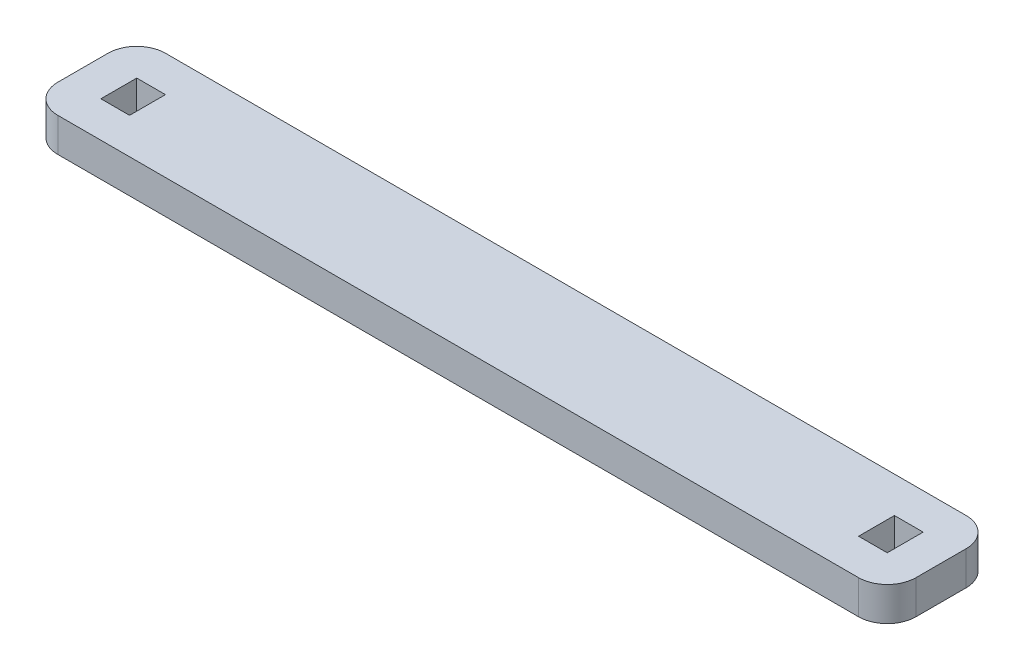
ISO-10303-21;
HEADER;
FILE_DESCRIPTION(('STEP AP214'),'2;1');
FILE_NAME('part.step','',(''),(''),'','','');
FILE_SCHEMA(('AUTOMOTIVE_DESIGN { 1 0 10303 214 1 1 1 1 }'));
ENDSEC;
DATA;
#1=APPLICATION_CONTEXT('core data for automotive mechanical design processes');
#2=APPLICATION_PROTOCOL_DEFINITION('international standard','automotive_design',2000,#1);
#3=PRODUCT_CONTEXT('',#1,'mechanical');
#4=PRODUCT('Part','Part','',(#3));
#5=PRODUCT_RELATED_PRODUCT_CATEGORY('part','',(#4));
#6=PRODUCT_DEFINITION_FORMATION('','',#4);
#7=PRODUCT_DEFINITION_CONTEXT('part definition',#1,'design');
#8=PRODUCT_DEFINITION('design','',#6,#7);
#9=PRODUCT_DEFINITION_SHAPE('','',#8);
#10=(LENGTH_UNIT() NAMED_UNIT(*) SI_UNIT(.MILLI.,.METRE.));
#11=(NAMED_UNIT(*) PLANE_ANGLE_UNIT() SI_UNIT($,.RADIAN.));
#12=(NAMED_UNIT(*) SI_UNIT($,.STERADIAN.) SOLID_ANGLE_UNIT());
#13=UNCERTAINTY_MEASURE_WITH_UNIT(LENGTH_MEASURE(1.E-05),#10,'distance_accuracy_value','');
#14=(GEOMETRIC_REPRESENTATION_CONTEXT(3) GLOBAL_UNCERTAINTY_ASSIGNED_CONTEXT((#13)) GLOBAL_UNIT_ASSIGNED_CONTEXT((#10,
#11,#12)) REPRESENTATION_CONTEXT('',''));
#15=CARTESIAN_POINT('',(0.,0.,0.));
#16=DIRECTION('',(0.,0.,1.));
#17=DIRECTION('',(1.,0.,0.));
#18=AXIS2_PLACEMENT_3D('',#15,#16,#17);
#19=CARTESIAN_POINT('',(0.,1.5,0.));
#20=DIRECTION('',(0.,1.,0.));
#21=DIRECTION('',(0.,0.,1.));
#22=AXIS2_PLACEMENT_3D('',#19,#20,#21);
#23=PLANE('',#22);
#24=DIRECTION('',(-1.,0.,0.));
#25=VECTOR('',#24,1.);
#26=CARTESIAN_POINT('',(37.973,1.5,-4.7625));
#27=LINE('',#26,#25);
#28=CARTESIAN_POINT('',(35.433,1.5,-4.7625));
#29=VERTEX_POINT('',#28);
#30=CARTESIAN_POINT('',(-35.433,1.5,-4.7625));
#31=VERTEX_POINT('',#30);
#32=EDGE_CURVE('E268',#29,#31,#27,.T.);
#33=ORIENTED_EDGE('',*,*,#32,.T.);
#34=CARTESIAN_POINT('',(-35.433,1.5,-2.2225));
#35=DIRECTION('',(0.,1.,0.));
#36=DIRECTION('',(0.,0.,1.));
#37=AXIS2_PLACEMENT_3D('',#34,#35,#36);
#38=CIRCLE('',#37,2.54);
#39=CARTESIAN_POINT('',(-37.973,1.5,-2.2225));
#40=VERTEX_POINT('',#39);
#41=EDGE_CURVE('E319',#31,#40,#38,.T.);
#42=ORIENTED_EDGE('',*,*,#41,.T.);
#43=DIRECTION('',(0.,0.,1.));
#44=VECTOR('',#43,1.);
#45=CARTESIAN_POINT('',(-37.973,1.5,4.7625));
#46=LINE('',#45,#44);
#47=CARTESIAN_POINT('',(-37.973,1.5,2.2225));
#48=VERTEX_POINT('',#47);
#49=EDGE_CURVE('E257',#40,#48,#46,.T.);
#50=ORIENTED_EDGE('',*,*,#49,.T.);
#51=CARTESIAN_POINT('',(-35.433,1.5,2.2225));
#52=DIRECTION('',(0.,1.,0.));
#53=DIRECTION('',(0.,0.,1.));
#54=AXIS2_PLACEMENT_3D('',#51,#52,#53);
#55=CIRCLE('',#54,2.54);
#56=CARTESIAN_POINT('',(-35.433,1.5,4.7625));
#57=VERTEX_POINT('',#56);
#58=EDGE_CURVE('E311',#48,#57,#55,.T.);
#59=ORIENTED_EDGE('',*,*,#58,.T.);
#60=DIRECTION('',(1.,0.,0.));
#61=VECTOR('',#60,1.);
#62=CARTESIAN_POINT('',(37.973,1.5,4.7625));
#63=LINE('',#62,#61);
#64=CARTESIAN_POINT('',(35.433,1.5,4.7625));
#65=VERTEX_POINT('',#64);
#66=EDGE_CURVE('E261',#57,#65,#63,.T.);
#67=ORIENTED_EDGE('',*,*,#66,.T.);
#68=CARTESIAN_POINT('',(35.433,1.5,2.2225));
#69=DIRECTION('',(0.,1.,0.));
#70=DIRECTION('',(0.,0.,1.));
#71=AXIS2_PLACEMENT_3D('',#68,#69,#70);
#72=CIRCLE('',#71,2.54);
#73=CARTESIAN_POINT('',(37.973,1.5,2.2225));
#74=VERTEX_POINT('',#73);
#75=EDGE_CURVE('E68',#65,#74,#72,.T.);
#76=ORIENTED_EDGE('',*,*,#75,.T.);
#77=DIRECTION('',(0.,0.,-1.));
#78=VECTOR('',#77,1.);
#79=CARTESIAN_POINT('',(37.973,1.5,4.7625));
#80=LINE('',#79,#78);
#81=CARTESIAN_POINT('',(37.973,1.5,-2.2225));
#82=VERTEX_POINT('',#81);
#83=EDGE_CURVE('E265',#74,#82,#80,.T.);
#84=ORIENTED_EDGE('',*,*,#83,.T.);
#85=CARTESIAN_POINT('',(35.433,1.5,-2.2225));
#86=DIRECTION('',(0.,1.,0.));
#87=DIRECTION('',(0.,0.,1.));
#88=AXIS2_PLACEMENT_3D('',#85,#86,#87);
#89=CIRCLE('',#88,2.54);
#90=EDGE_CURVE('E316',#82,#29,#89,.T.);
#91=ORIENTED_EDGE('',*,*,#90,.T.);
#92=EDGE_LOOP('',(#33,#42,#50,#59,#67,#76,#84,#91));
#93=FACE_BOUND('',#92,.T.);
#94=DIRECTION('',(1.,0.,0.));
#95=VECTOR('',#94,1.);
#96=CARTESIAN_POINT('',(-32.258,1.5,1.5875));
#97=LINE('',#96,#95);
#98=CARTESIAN_POINT('',(-34.798,1.5,1.5875));
#99=VERTEX_POINT('',#98);
#100=CARTESIAN_POINT('',(-32.258,1.5,1.5875));
#101=VERTEX_POINT('',#100);
#102=EDGE_CURVE('E217',#99,#101,#97,.T.);
#103=ORIENTED_EDGE('',*,*,#102,.F.);
#104=DIRECTION('',(0.,0.,1.));
#105=VECTOR('',#104,1.);
#106=CARTESIAN_POINT('',(-34.798,1.5,1.5875));
#107=LINE('',#106,#105);
#108=CARTESIAN_POINT('',(-34.798,1.5,-1.5875));
#109=VERTEX_POINT('',#108);
#110=EDGE_CURVE('E214',#109,#99,#107,.T.);
#111=ORIENTED_EDGE('',*,*,#110,.F.);
#112=DIRECTION('',(-1.,0.,0.));
#113=VECTOR('',#112,1.);
#114=CARTESIAN_POINT('',(-32.258,1.5,-1.5875));
#115=LINE('',#114,#113);
#116=CARTESIAN_POINT('',(-32.258,1.5,-1.5875));
#117=VERTEX_POINT('',#116);
#118=EDGE_CURVE('E225',#117,#109,#115,.T.);
#119=ORIENTED_EDGE('',*,*,#118,.F.);
#120=DIRECTION('',(0.,0.,-1.));
#121=VECTOR('',#120,1.);
#122=CARTESIAN_POINT('',(-32.258,1.5,1.5875));
#123=LINE('',#122,#121);
#124=EDGE_CURVE('E221',#101,#117,#123,.T.);
#125=ORIENTED_EDGE('',*,*,#124,.F.);
#126=EDGE_LOOP('',(#103,#111,#119,#125));
#127=FACE_BOUND('',#126,.T.);
#128=DIRECTION('',(1.,0.,0.));
#129=VECTOR('',#128,1.);
#130=CARTESIAN_POINT('',(34.798,1.5,1.5875));
#131=LINE('',#130,#129);
#132=CARTESIAN_POINT('',(32.258,1.5,1.5875));
#133=VERTEX_POINT('',#132);
#134=CARTESIAN_POINT('',(34.798,1.5,1.5875));
#135=VERTEX_POINT('',#134);
#136=EDGE_CURVE('E172',#133,#135,#131,.T.);
#137=ORIENTED_EDGE('',*,*,#136,.F.);
#138=DIRECTION('',(0.,0.,1.));
#139=VECTOR('',#138,1.);
#140=CARTESIAN_POINT('',(32.258,1.5,1.5875));
#141=LINE('',#140,#139);
#142=CARTESIAN_POINT('',(32.258,1.5,-1.5875));
#143=VERTEX_POINT('',#142);
#144=EDGE_CURVE('E161',#143,#133,#141,.T.);
#145=ORIENTED_EDGE('',*,*,#144,.F.);
#146=DIRECTION('',(-1.,0.,0.));
#147=VECTOR('',#146,1.);
#148=CARTESIAN_POINT('',(34.798,1.5,-1.5875));
#149=LINE('',#148,#147);
#150=CARTESIAN_POINT('',(34.798,1.5,-1.5875));
#151=VERTEX_POINT('',#150);
#152=EDGE_CURVE('E190',#151,#143,#149,.T.);
#153=ORIENTED_EDGE('',*,*,#152,.F.);
#154=DIRECTION('',(0.,0.,-1.));
#155=VECTOR('',#154,1.);
#156=CARTESIAN_POINT('',(34.798,1.5,1.5875));
#157=LINE('',#156,#155);
#158=EDGE_CURVE('E186',#135,#151,#157,.T.);
#159=ORIENTED_EDGE('',*,*,#158,.F.);
#160=EDGE_LOOP('',(#137,#145,#153,#159));
#161=FACE_BOUND('',#160,.T.);
#162=ADVANCED_FACE('F45',(#93,#127,#161),#23,.T.);
#163=CARTESIAN_POINT('',(0.,-1.5,0.));
#164=DIRECTION('',(0.,1.,0.));
#165=DIRECTION('',(0.,0.,1.));
#166=AXIS2_PLACEMENT_3D('',#163,#164,#165);
#167=PLANE('',#166);
#168=DIRECTION('',(0.,0.,1.));
#169=VECTOR('',#168,1.);
#170=CARTESIAN_POINT('',(-34.798,-1.5,1.5875));
#171=LINE('',#170,#169);
#172=CARTESIAN_POINT('',(-34.798,-1.5,-1.5875));
#173=VERTEX_POINT('',#172);
#174=CARTESIAN_POINT('',(-34.798,-1.5,1.5875));
#175=VERTEX_POINT('',#174);
#176=EDGE_CURVE('E181',#173,#175,#171,.T.);
#177=ORIENTED_EDGE('',*,*,#176,.T.);
#178=DIRECTION('',(1.,0.,0.));
#179=VECTOR('',#178,1.);
#180=CARTESIAN_POINT('',(-32.258,-1.5,1.5875));
#181=LINE('',#180,#179);
#182=CARTESIAN_POINT('',(-32.258,-1.5,1.5875));
#183=VERTEX_POINT('',#182);
#184=EDGE_CURVE('E232',#175,#183,#181,.T.);
#185=ORIENTED_EDGE('',*,*,#184,.T.);
#186=DIRECTION('',(0.,0.,-1.));
#187=VECTOR('',#186,1.);
#188=CARTESIAN_POINT('',(-32.258,-1.5,1.5875));
#189=LINE('',#188,#187);
#190=CARTESIAN_POINT('',(-32.258,-1.5,-1.5875));
#191=VERTEX_POINT('',#190);
#192=EDGE_CURVE('E236',#183,#191,#189,.T.);
#193=ORIENTED_EDGE('',*,*,#192,.T.);
#194=DIRECTION('',(-1.,0.,0.));
#195=VECTOR('',#194,1.);
#196=CARTESIAN_POINT('',(-32.258,-1.5,-1.5875));
#197=LINE('',#196,#195);
#198=EDGE_CURVE('E218',#191,#173,#197,.T.);
#199=ORIENTED_EDGE('',*,*,#198,.T.);
#200=EDGE_LOOP('',(#177,#185,#193,#199));
#201=FACE_BOUND('',#200,.T.);
#202=DIRECTION('',(0.,0.,1.));
#203=VECTOR('',#202,1.);
#204=CARTESIAN_POINT('',(-37.973,-1.5,4.7625));
#205=LINE('',#204,#203);
#206=CARTESIAN_POINT('',(-37.973,-1.5,-2.2225));
#207=VERTEX_POINT('',#206);
#208=CARTESIAN_POINT('',(-37.973,-1.5,2.2225));
#209=VERTEX_POINT('',#208);
#210=EDGE_CURVE('E256',#207,#209,#205,.T.);
#211=ORIENTED_EDGE('',*,*,#210,.F.);
#212=CARTESIAN_POINT('',(-35.433,-1.5,-2.2225));
#213=DIRECTION('',(0.,1.,0.));
#214=DIRECTION('',(0.,0.,1.));
#215=AXIS2_PLACEMENT_3D('',#212,#213,#214);
#216=CIRCLE('',#215,2.54);
#217=CARTESIAN_POINT('',(-35.433,-1.5,-4.7625));
#218=VERTEX_POINT('',#217);
#219=EDGE_CURVE('E301',#207,#218,#216,.F.);
#220=ORIENTED_EDGE('',*,*,#219,.T.);
#221=DIRECTION('',(-1.,0.,0.));
#222=VECTOR('',#221,1.);
#223=CARTESIAN_POINT('',(37.973,-1.5,-4.7625));
#224=LINE('',#223,#222);
#225=CARTESIAN_POINT('',(35.433,-1.5,-4.7625));
#226=VERTEX_POINT('',#225);
#227=EDGE_CURVE('E262',#226,#218,#224,.T.);
#228=ORIENTED_EDGE('',*,*,#227,.F.);
#229=CARTESIAN_POINT('',(35.433,-1.5,-2.2225));
#230=DIRECTION('',(0.,1.,0.));
#231=DIRECTION('',(0.,0.,1.));
#232=AXIS2_PLACEMENT_3D('',#229,#230,#231);
#233=CIRCLE('',#232,2.54);
#234=CARTESIAN_POINT('',(37.973,-1.5,-2.2225));
#235=VERTEX_POINT('',#234);
#236=EDGE_CURVE('E298',#226,#235,#233,.F.);
#237=ORIENTED_EDGE('',*,*,#236,.T.);
#238=DIRECTION('',(0.,0.,-1.));
#239=VECTOR('',#238,1.);
#240=CARTESIAN_POINT('',(37.973,-1.5,4.7625));
#241=LINE('',#240,#239);
#242=CARTESIAN_POINT('',(37.973,-1.5,2.2225));
#243=VERTEX_POINT('',#242);
#244=EDGE_CURVE('E280',#243,#235,#241,.T.);
#245=ORIENTED_EDGE('',*,*,#244,.F.);
#246=CARTESIAN_POINT('',(35.433,-1.5,2.2225));
#247=DIRECTION('',(0.,1.,0.));
#248=DIRECTION('',(0.,0.,1.));
#249=AXIS2_PLACEMENT_3D('',#246,#247,#248);
#250=CIRCLE('',#249,2.54);
#251=CARTESIAN_POINT('',(35.433,-1.5,4.7625));
#252=VERTEX_POINT('',#251);
#253=EDGE_CURVE('E295',#243,#252,#250,.F.);
#254=ORIENTED_EDGE('',*,*,#253,.T.);
#255=DIRECTION('',(1.,0.,0.));
#256=VECTOR('',#255,1.);
#257=CARTESIAN_POINT('',(37.973,-1.5,4.7625));
#258=LINE('',#257,#256);
#259=CARTESIAN_POINT('',(-35.433,-1.5,4.7625));
#260=VERTEX_POINT('',#259);
#261=EDGE_CURVE('E276',#260,#252,#258,.T.);
#262=ORIENTED_EDGE('',*,*,#261,.F.);
#263=CARTESIAN_POINT('',(-35.433,-1.5,2.2225));
#264=DIRECTION('',(0.,1.,0.));
#265=DIRECTION('',(0.,0.,1.));
#266=AXIS2_PLACEMENT_3D('',#263,#264,#265);
#267=CIRCLE('',#266,2.54);
#268=EDGE_CURVE('E292',#260,#209,#267,.F.);
#269=ORIENTED_EDGE('',*,*,#268,.T.);
#270=EDGE_LOOP('',(#211,#220,#228,#237,#245,#254,#262,#269));
#271=FACE_BOUND('',#270,.T.);
#272=DIRECTION('',(0.,0.,1.));
#273=VECTOR('',#272,1.);
#274=CARTESIAN_POINT('',(32.258,-1.5,1.5875));
#275=LINE('',#274,#273);
#276=CARTESIAN_POINT('',(32.258,-1.5,-1.5875));
#277=VERTEX_POINT('',#276);
#278=CARTESIAN_POINT('',(32.258,-1.5,1.5875));
#279=VERTEX_POINT('',#278);
#280=EDGE_CURVE('E195',#277,#279,#275,.T.);
#281=ORIENTED_EDGE('',*,*,#280,.T.);
#282=DIRECTION('',(1.,0.,0.));
#283=VECTOR('',#282,1.);
#284=CARTESIAN_POINT('',(34.798,-1.5,1.5875));
#285=LINE('',#284,#283);
#286=CARTESIAN_POINT('',(34.798,-1.5,1.5875));
#287=VERTEX_POINT('',#286);
#288=EDGE_CURVE('E179',#279,#287,#285,.T.);
#289=ORIENTED_EDGE('',*,*,#288,.T.);
#290=DIRECTION('',(0.,0.,-1.));
#291=VECTOR('',#290,1.);
#292=CARTESIAN_POINT('',(34.798,-1.5,1.5875));
#293=LINE('',#292,#291);
#294=CARTESIAN_POINT('',(34.798,-1.5,-1.5875));
#295=VERTEX_POINT('',#294);
#296=EDGE_CURVE('E200',#287,#295,#293,.T.);
#297=ORIENTED_EDGE('',*,*,#296,.T.);
#298=DIRECTION('',(-1.,0.,0.));
#299=VECTOR('',#298,1.);
#300=CARTESIAN_POINT('',(34.798,-1.5,-1.5875));
#301=LINE('',#300,#299);
#302=EDGE_CURVE('E173',#295,#277,#301,.T.);
#303=ORIENTED_EDGE('',*,*,#302,.T.);
#304=EDGE_LOOP('',(#281,#289,#297,#303));
#305=FACE_BOUND('',#304,.T.);
#306=ADVANCED_FACE('F339',(#201,#271,#305),#167,.F.);
#307=CARTESIAN_POINT('',(-37.973,1.5,4.7625));
#308=DIRECTION('',(1.,0.,0.));
#309=DIRECTION('',(0.,0.,-1.));
#310=AXIS2_PLACEMENT_3D('',#307,#308,#309);
#311=PLANE('',#310);
#312=ORIENTED_EDGE('',*,*,#49,.F.);
#313=DIRECTION('',(0.,-1.,0.));
#314=VECTOR('',#313,1.);
#315=CARTESIAN_POINT('',(-37.973,1.5,-2.2225));
#316=LINE('',#315,#314);
#317=EDGE_CURVE('E288',#40,#207,#316,.T.);
#318=ORIENTED_EDGE('',*,*,#317,.T.);
#319=ORIENTED_EDGE('',*,*,#210,.T.);
#320=DIRECTION('',(0.,-1.,0.));
#321=VECTOR('',#320,1.);
#322=CARTESIAN_POINT('',(-37.973,1.5,2.2225));
#323=LINE('',#322,#321);
#324=EDGE_CURVE('E272',#209,#48,#323,.F.);
#325=ORIENTED_EDGE('',*,*,#324,.T.);
#326=EDGE_LOOP('',(#312,#318,#319,#325));
#327=FACE_BOUND('',#326,.T.);
#328=ADVANCED_FACE('F362',(#327),#311,.F.);
#329=CARTESIAN_POINT('',(37.973,1.5,4.7625));
#330=DIRECTION('',(0.,0.,-1.));
#331=DIRECTION('',(-1.,0.,0.));
#332=AXIS2_PLACEMENT_3D('',#329,#330,#331);
#333=PLANE('',#332);
#334=ORIENTED_EDGE('',*,*,#261,.T.);
#335=DIRECTION('',(0.,-1.,0.));
#336=VECTOR('',#335,1.);
#337=CARTESIAN_POINT('',(35.433,1.5,4.7625));
#338=LINE('',#337,#336);
#339=EDGE_CURVE('E11',#252,#65,#338,.F.);
#340=ORIENTED_EDGE('',*,*,#339,.T.);
#341=ORIENTED_EDGE('',*,*,#66,.F.);
#342=DIRECTION('',(0.,-1.,0.));
#343=VECTOR('',#342,1.);
#344=CARTESIAN_POINT('',(-35.433,1.5,4.7625));
#345=LINE('',#344,#343);
#346=EDGE_CURVE('E54',#57,#260,#345,.T.);
#347=ORIENTED_EDGE('',*,*,#346,.T.);
#348=EDGE_LOOP('',(#334,#340,#341,#347));
#349=FACE_BOUND('',#348,.T.);
#350=ADVANCED_FACE('F333',(#349),#333,.F.);
#351=CARTESIAN_POINT('',(37.973,1.5,4.7625));
#352=DIRECTION('',(-1.,0.,0.));
#353=DIRECTION('',(0.,0.,1.));
#354=AXIS2_PLACEMENT_3D('',#351,#352,#353);
#355=PLANE('',#354);
#356=ORIENTED_EDGE('',*,*,#244,.T.);
#357=DIRECTION('',(0.,-1.,0.));
#358=VECTOR('',#357,1.);
#359=CARTESIAN_POINT('',(37.973,1.5,-2.2225));
#360=LINE('',#359,#358);
#361=EDGE_CURVE('E61',#235,#82,#360,.F.);
#362=ORIENTED_EDGE('',*,*,#361,.T.);
#363=ORIENTED_EDGE('',*,*,#83,.F.);
#364=DIRECTION('',(0.,-1.,0.));
#365=VECTOR('',#364,1.);
#366=CARTESIAN_POINT('',(37.973,1.5,2.2225));
#367=LINE('',#366,#365);
#368=EDGE_CURVE('E322',#74,#243,#367,.T.);
#369=ORIENTED_EDGE('',*,*,#368,.T.);
#370=EDGE_LOOP('',(#356,#362,#363,#369));
#371=FACE_BOUND('',#370,.T.);
#372=ADVANCED_FACE('F345',(#371),#355,.F.);
#373=CARTESIAN_POINT('',(37.973,1.5,-4.7625));
#374=DIRECTION('',(0.,0.,1.));
#375=DIRECTION('',(1.,0.,0.));
#376=AXIS2_PLACEMENT_3D('',#373,#374,#375);
#377=PLANE('',#376);
#378=ORIENTED_EDGE('',*,*,#227,.T.);
#379=DIRECTION('',(0.,-1.,0.));
#380=VECTOR('',#379,1.);
#381=CARTESIAN_POINT('',(-35.433,1.5,-4.7625));
#382=LINE('',#381,#380);
#383=EDGE_CURVE('E308',#218,#31,#382,.F.);
#384=ORIENTED_EDGE('',*,*,#383,.T.);
#385=ORIENTED_EDGE('',*,*,#32,.F.);
#386=DIRECTION('',(0.,-1.,0.));
#387=VECTOR('',#386,1.);
#388=CARTESIAN_POINT('',(35.433,1.5,-4.7625));
#389=LINE('',#388,#387);
#390=EDGE_CURVE('E304',#29,#226,#389,.T.);
#391=ORIENTED_EDGE('',*,*,#390,.T.);
#392=EDGE_LOOP('',(#378,#384,#385,#391));
#393=FACE_BOUND('',#392,.T.);
#394=ADVANCED_FACE('F354',(#393),#377,.F.);
#395=CARTESIAN_POINT('',(-34.798,1.5,1.5875));
#396=DIRECTION('',(1.,0.,0.));
#397=DIRECTION('',(0.,0.,-1.));
#398=AXIS2_PLACEMENT_3D('',#395,#396,#397);
#399=PLANE('',#398);
#400=ORIENTED_EDGE('',*,*,#176,.F.);
#401=DIRECTION('',(0.,-1.,0.));
#402=VECTOR('',#401,1.);
#403=CARTESIAN_POINT('',(-34.798,1.5,-1.5875));
#404=LINE('',#403,#402);
#405=EDGE_CURVE('E228',#109,#173,#404,.T.);
#406=ORIENTED_EDGE('',*,*,#405,.F.);
#407=ORIENTED_EDGE('',*,*,#110,.T.);
#408=DIRECTION('',(0.,-1.,0.));
#409=VECTOR('',#408,1.);
#410=CARTESIAN_POINT('',(-34.798,1.5,1.5875));
#411=LINE('',#410,#409);
#412=EDGE_CURVE('E252',#99,#175,#411,.T.);
#413=ORIENTED_EDGE('',*,*,#412,.T.);
#414=EDGE_LOOP('',(#400,#406,#407,#413));
#415=FACE_BOUND('',#414,.T.);
#416=ADVANCED_FACE('F377',(#415),#399,.T.);
#417=CARTESIAN_POINT('',(-32.258,1.5,1.5875));
#418=DIRECTION('',(0.,0.,-1.));
#419=DIRECTION('',(-1.,0.,0.));
#420=AXIS2_PLACEMENT_3D('',#417,#418,#419);
#421=PLANE('',#420);
#422=ORIENTED_EDGE('',*,*,#184,.F.);
#423=ORIENTED_EDGE('',*,*,#412,.F.);
#424=ORIENTED_EDGE('',*,*,#102,.T.);
#425=DIRECTION('',(0.,-1.,0.));
#426=VECTOR('',#425,1.);
#427=CARTESIAN_POINT('',(-32.258,1.5,1.5875));
#428=LINE('',#427,#426);
#429=EDGE_CURVE('E249',#101,#183,#428,.T.);
#430=ORIENTED_EDGE('',*,*,#429,.T.);
#431=EDGE_LOOP('',(#422,#423,#424,#430));
#432=FACE_BOUND('',#431,.T.);
#433=ADVANCED_FACE('F459',(#432),#421,.T.);
#434=CARTESIAN_POINT('',(-32.258,1.5,1.5875));
#435=DIRECTION('',(-1.,0.,0.));
#436=DIRECTION('',(0.,0.,1.));
#437=AXIS2_PLACEMENT_3D('',#434,#435,#436);
#438=PLANE('',#437);
#439=ORIENTED_EDGE('',*,*,#192,.F.);
#440=ORIENTED_EDGE('',*,*,#429,.F.);
#441=ORIENTED_EDGE('',*,*,#124,.T.);
#442=DIRECTION('',(0.,-1.,0.));
#443=VECTOR('',#442,1.);
#444=CARTESIAN_POINT('',(-32.258,1.5,-1.5875));
#445=LINE('',#444,#443);
#446=EDGE_CURVE('E246',#117,#191,#445,.T.);
#447=ORIENTED_EDGE('',*,*,#446,.T.);
#448=EDGE_LOOP('',(#439,#440,#441,#447));
#449=FACE_BOUND('',#448,.T.);
#450=ADVANCED_FACE('F450',(#449),#438,.T.);
#451=CARTESIAN_POINT('',(-32.258,1.5,-1.5875));
#452=DIRECTION('',(0.,0.,1.));
#453=DIRECTION('',(1.,0.,0.));
#454=AXIS2_PLACEMENT_3D('',#451,#452,#453);
#455=PLANE('',#454);
#456=ORIENTED_EDGE('',*,*,#198,.F.);
#457=ORIENTED_EDGE('',*,*,#446,.F.);
#458=ORIENTED_EDGE('',*,*,#118,.T.);
#459=ORIENTED_EDGE('',*,*,#405,.T.);
#460=EDGE_LOOP('',(#456,#457,#458,#459));
#461=FACE_BOUND('',#460,.T.);
#462=ADVANCED_FACE('F442',(#461),#455,.T.);
#463=CARTESIAN_POINT('',(32.258,1.5,1.5875));
#464=DIRECTION('',(1.,0.,0.));
#465=DIRECTION('',(0.,0.,-1.));
#466=AXIS2_PLACEMENT_3D('',#463,#464,#465);
#467=PLANE('',#466);
#468=ORIENTED_EDGE('',*,*,#280,.F.);
#469=DIRECTION('',(0.,-1.,0.));
#470=VECTOR('',#469,1.);
#471=CARTESIAN_POINT('',(32.258,1.5,-1.5875));
#472=LINE('',#471,#470);
#473=EDGE_CURVE('E167',#143,#277,#472,.T.);
#474=ORIENTED_EDGE('',*,*,#473,.F.);
#475=ORIENTED_EDGE('',*,*,#144,.T.);
#476=DIRECTION('',(0.,-1.,0.));
#477=VECTOR('',#476,1.);
#478=CARTESIAN_POINT('',(32.258,1.5,1.5875));
#479=LINE('',#478,#477);
#480=EDGE_CURVE('E164',#133,#279,#479,.T.);
#481=ORIENTED_EDGE('',*,*,#480,.T.);
#482=EDGE_LOOP('',(#468,#474,#475,#481));
#483=FACE_BOUND('',#482,.T.);
#484=ADVANCED_FACE('F163',(#483),#467,.T.);
#485=CARTESIAN_POINT('',(34.798,1.5,1.5875));
#486=DIRECTION('',(0.,0.,-1.));
#487=DIRECTION('',(-1.,0.,0.));
#488=AXIS2_PLACEMENT_3D('',#485,#486,#487);
#489=PLANE('',#488);
#490=ORIENTED_EDGE('',*,*,#288,.F.);
#491=ORIENTED_EDGE('',*,*,#480,.F.);
#492=ORIENTED_EDGE('',*,*,#136,.T.);
#493=DIRECTION('',(0.,-1.,0.));
#494=VECTOR('',#493,1.);
#495=CARTESIAN_POINT('',(34.798,1.5,1.5875));
#496=LINE('',#495,#494);
#497=EDGE_CURVE('E182',#135,#287,#496,.T.);
#498=ORIENTED_EDGE('',*,*,#497,.T.);
#499=EDGE_LOOP('',(#490,#491,#492,#498));
#500=FACE_BOUND('',#499,.T.);
#501=ADVANCED_FACE('F176',(#500),#489,.T.);
#502=CARTESIAN_POINT('',(34.798,1.5,1.5875));
#503=DIRECTION('',(-1.,0.,0.));
#504=DIRECTION('',(0.,0.,1.));
#505=AXIS2_PLACEMENT_3D('',#502,#503,#504);
#506=PLANE('',#505);
#507=ORIENTED_EDGE('',*,*,#296,.F.);
#508=ORIENTED_EDGE('',*,*,#497,.F.);
#509=ORIENTED_EDGE('',*,*,#158,.T.);
#510=DIRECTION('',(0.,-1.,0.));
#511=VECTOR('',#510,1.);
#512=CARTESIAN_POINT('',(34.798,1.5,-1.5875));
#513=LINE('',#512,#511);
#514=EDGE_CURVE('E209',#151,#295,#513,.T.);
#515=ORIENTED_EDGE('',*,*,#514,.T.);
#516=EDGE_LOOP('',(#507,#508,#509,#515));
#517=FACE_BOUND('',#516,.T.);
#518=ADVANCED_FACE('F418',(#517),#506,.T.);
#519=CARTESIAN_POINT('',(34.798,1.5,-1.5875));
#520=DIRECTION('',(0.,0.,1.));
#521=DIRECTION('',(1.,0.,0.));
#522=AXIS2_PLACEMENT_3D('',#519,#520,#521);
#523=PLANE('',#522);
#524=ORIENTED_EDGE('',*,*,#302,.F.);
#525=ORIENTED_EDGE('',*,*,#514,.F.);
#526=ORIENTED_EDGE('',*,*,#152,.T.);
#527=ORIENTED_EDGE('',*,*,#473,.T.);
#528=EDGE_LOOP('',(#524,#525,#526,#527));
#529=FACE_BOUND('',#528,.T.);
#530=ADVANCED_FACE('F390',(#529),#523,.T.);
#531=CARTESIAN_POINT('',(-35.433,1.5,-2.2225));
#532=DIRECTION('',(0.,-1.,0.));
#533=DIRECTION('',(0.,0.,-1.));
#534=AXIS2_PLACEMENT_3D('',#531,#532,#533);
#535=CYLINDRICAL_SURFACE('',#534,2.54);
#536=ORIENTED_EDGE('',*,*,#41,.F.);
#537=ORIENTED_EDGE('',*,*,#383,.F.);
#538=ORIENTED_EDGE('',*,*,#219,.F.);
#539=ORIENTED_EDGE('',*,*,#317,.F.);
#540=EDGE_LOOP('',(#536,#537,#538,#539));
#541=FACE_BOUND('',#540,.T.);
#542=ADVANCED_FACE('F359',(#541),#535,.T.);
#543=CARTESIAN_POINT('',(35.433,1.5,-2.2225));
#544=DIRECTION('',(0.,-1.,0.));
#545=DIRECTION('',(0.,0.,-1.));
#546=AXIS2_PLACEMENT_3D('',#543,#544,#545);
#547=CYLINDRICAL_SURFACE('',#546,2.54);
#548=ORIENTED_EDGE('',*,*,#90,.F.);
#549=ORIENTED_EDGE('',*,*,#361,.F.);
#550=ORIENTED_EDGE('',*,*,#236,.F.);
#551=ORIENTED_EDGE('',*,*,#390,.F.);
#552=EDGE_LOOP('',(#548,#549,#550,#551));
#553=FACE_BOUND('',#552,.T.);
#554=ADVANCED_FACE('F351',(#553),#547,.T.);
#555=CARTESIAN_POINT('',(35.433,1.5,2.2225));
#556=DIRECTION('',(0.,-1.,0.));
#557=DIRECTION('',(0.,0.,-1.));
#558=AXIS2_PLACEMENT_3D('',#555,#556,#557);
#559=CYLINDRICAL_SURFACE('',#558,2.54);
#560=ORIENTED_EDGE('',*,*,#75,.F.);
#561=ORIENTED_EDGE('',*,*,#339,.F.);
#562=ORIENTED_EDGE('',*,*,#253,.F.);
#563=ORIENTED_EDGE('',*,*,#368,.F.);
#564=EDGE_LOOP('',(#560,#561,#562,#563));
#565=FACE_BOUND('',#564,.T.);
#566=ADVANCED_FACE('F344',(#565),#559,.T.);
#567=CARTESIAN_POINT('',(-35.433,1.5,2.2225));
#568=DIRECTION('',(0.,-1.,0.));
#569=DIRECTION('',(0.,0.,-1.));
#570=AXIS2_PLACEMENT_3D('',#567,#568,#569);
#571=CYLINDRICAL_SURFACE('',#570,2.54);
#572=ORIENTED_EDGE('',*,*,#58,.F.);
#573=ORIENTED_EDGE('',*,*,#324,.F.);
#574=ORIENTED_EDGE('',*,*,#268,.F.);
#575=ORIENTED_EDGE('',*,*,#346,.F.);
#576=EDGE_LOOP('',(#572,#573,#574,#575));
#577=FACE_BOUND('',#576,.T.);
#578=ADVANCED_FACE('F47',(#577),#571,.T.);
#579=CLOSED_SHELL('',(#162,#306,#328,#350,#372,#394,#416,#433,#450,#462,#484,#501,#518,#530,
#542,#554,#566,#578));
#580=MANIFOLD_SOLID_BREP('B2',#579);
#581=ADVANCED_BREP_SHAPE_REPRESENTATION('',(#18,#580),#14);
#582=SHAPE_DEFINITION_REPRESENTATION(#9,#581);
ENDSEC;
END-ISO-10303-21;
